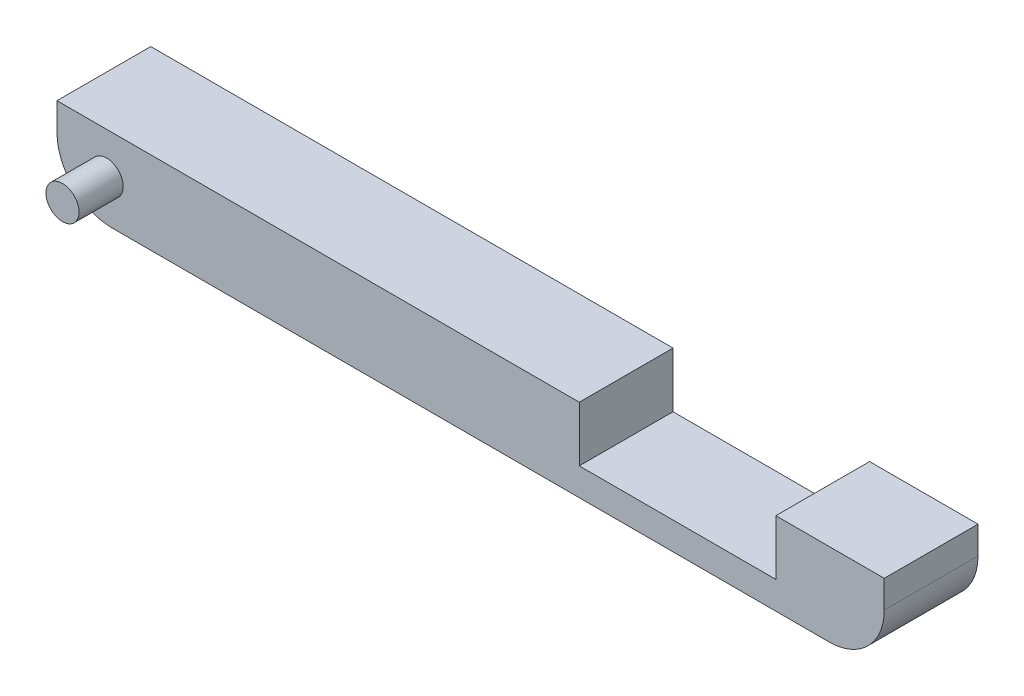
ISO-10303-21;
HEADER;
FILE_DESCRIPTION(('STEP AP214'),'2;1');
FILE_NAME('part.step','',(''),(''),'','','');
FILE_SCHEMA(('AUTOMOTIVE_DESIGN { 1 0 10303 214 1 1 1 1 }'));
ENDSEC;
DATA;
#1=APPLICATION_CONTEXT('core data for automotive mechanical design processes');
#2=APPLICATION_PROTOCOL_DEFINITION('international standard','automotive_design',2000,#1);
#3=PRODUCT_CONTEXT('',#1,'mechanical');
#4=PRODUCT('Part','Part','',(#3));
#5=PRODUCT_RELATED_PRODUCT_CATEGORY('part','',(#4));
#6=PRODUCT_DEFINITION_FORMATION('','',#4);
#7=PRODUCT_DEFINITION_CONTEXT('part definition',#1,'design');
#8=PRODUCT_DEFINITION('design','',#6,#7);
#9=PRODUCT_DEFINITION_SHAPE('','',#8);
#10=(LENGTH_UNIT() NAMED_UNIT(*) SI_UNIT(.MILLI.,.METRE.));
#11=(NAMED_UNIT(*) PLANE_ANGLE_UNIT() SI_UNIT($,.RADIAN.));
#12=(NAMED_UNIT(*) SI_UNIT($,.STERADIAN.) SOLID_ANGLE_UNIT());
#13=UNCERTAINTY_MEASURE_WITH_UNIT(LENGTH_MEASURE(1.E-05),#10,'distance_accuracy_value','');
#14=(GEOMETRIC_REPRESENTATION_CONTEXT(3) GLOBAL_UNCERTAINTY_ASSIGNED_CONTEXT((#13)) GLOBAL_UNIT_ASSIGNED_CONTEXT((#10,
#11,#12)) REPRESENTATION_CONTEXT('',''));
#15=CARTESIAN_POINT('',(0.,0.,0.));
#16=DIRECTION('',(0.,0.,1.));
#17=DIRECTION('',(1.,0.,0.));
#18=AXIS2_PLACEMENT_3D('',#15,#16,#17);
#19=CARTESIAN_POINT('',(34.1093117408907,-5.34817813765183,17.));
#20=DIRECTION('',(-1.,0.,0.));
#21=DIRECTION('',(0.,0.,1.));
#22=AXIS2_PLACEMENT_3D('',#19,#20,#21);
#23=PLANE('',#22);
#24=DIRECTION('',(0.,1.,0.));
#25=VECTOR('',#24,1.);
#26=CARTESIAN_POINT('',(34.1093117408907,-5.34817813765183,0.));
#27=LINE('',#26,#25);
#28=CARTESIAN_POINT('',(34.1093117408907,-15.3481781376518,0.));
#29=VERTEX_POINT('',#28);
#30=CARTESIAN_POINT('',(34.1093117408907,-5.34817813765183,0.));
#31=VERTEX_POINT('',#30);
#32=EDGE_CURVE('E157',#29,#31,#27,.T.);
#33=ORIENTED_EDGE('',*,*,#32,.T.);
#34=DIRECTION('',(0.,0.,-1.));
#35=VECTOR('',#34,1.);
#36=CARTESIAN_POINT('',(34.1093117408907,-5.34817813765183,17.));
#37=LINE('',#36,#35);
#38=CARTESIAN_POINT('',(34.1093117408907,-5.34817813765183,17.));
#39=VERTEX_POINT('',#38);
#40=EDGE_CURVE('E11',#39,#31,#37,.T.);
#41=ORIENTED_EDGE('',*,*,#40,.F.);
#42=DIRECTION('',(0.,1.,0.));
#43=VECTOR('',#42,1.);
#44=CARTESIAN_POINT('',(34.1093117408907,-5.34817813765183,17.));
#45=LINE('',#44,#43);
#46=CARTESIAN_POINT('',(34.1093117408907,-15.3481781376518,17.));
#47=VERTEX_POINT('',#46);
#48=EDGE_CURVE('E187',#47,#39,#45,.T.);
#49=ORIENTED_EDGE('',*,*,#48,.F.);
#50=DIRECTION('',(0.,0.,-1.));
#51=VECTOR('',#50,1.);
#52=CARTESIAN_POINT('',(34.1093117408907,-15.3481781376518,17.));
#53=LINE('',#52,#51);
#54=EDGE_CURVE('E153',#47,#29,#53,.T.);
#55=ORIENTED_EDGE('',*,*,#54,.T.);
#56=EDGE_LOOP('',(#33,#41,#49,#55));
#57=FACE_BOUND('',#56,.T.);
#58=ADVANCED_FACE('F45',(#57),#23,.F.);
#59=CARTESIAN_POINT('',(-60.5906882591093,-5.34817813765183,17.));
#60=DIRECTION('',(0.,-1.,0.));
#61=DIRECTION('',(0.,0.,-1.));
#62=AXIS2_PLACEMENT_3D('',#59,#60,#61);
#63=PLANE('',#62);
#64=DIRECTION('',(-1.,0.,0.));
#65=VECTOR('',#64,1.);
#66=CARTESIAN_POINT('',(-60.5906882591093,-5.34817813765183,0.));
#67=LINE('',#66,#65);
#68=CARTESIAN_POINT('',(-60.5906882591093,-5.34817813765183,0.));
#69=VERTEX_POINT('',#68);
#70=EDGE_CURVE('E161',#31,#69,#67,.T.);
#71=ORIENTED_EDGE('',*,*,#70,.T.);
#72=DIRECTION('',(0.,0.,-1.));
#73=VECTOR('',#72,1.);
#74=CARTESIAN_POINT('',(-60.5906882591093,-5.34817813765183,17.));
#75=LINE('',#74,#73);
#76=CARTESIAN_POINT('',(-60.5906882591093,-5.34817813765183,17.));
#77=VERTEX_POINT('',#76);
#78=EDGE_CURVE('E54',#77,#69,#75,.T.);
#79=ORIENTED_EDGE('',*,*,#78,.F.);
#80=DIRECTION('',(-1.,0.,0.));
#81=VECTOR('',#80,1.);
#82=CARTESIAN_POINT('',(-50.5906882591092,-5.34817813765183,17.));
#83=LINE('',#82,#81);
#84=EDGE_CURVE('E111',#39,#77,#83,.T.);
#85=ORIENTED_EDGE('',*,*,#84,.F.);
#86=ORIENTED_EDGE('',*,*,#40,.T.);
#87=EDGE_LOOP('',(#71,#79,#85,#86));
#88=FACE_BOUND('',#87,.T.);
#89=ADVANCED_FACE('F296',(#88),#63,.F.);
#90=CARTESIAN_POINT('',(-60.5906882591093,-5.34817813765183,17.));
#91=DIRECTION('',(1.,0.,0.));
#92=DIRECTION('',(0.,0.,-1.));
#93=AXIS2_PLACEMENT_3D('',#90,#91,#92);
#94=PLANE('',#93);
#95=DIRECTION('',(0.,-1.,0.));
#96=VECTOR('',#95,1.);
#97=CARTESIAN_POINT('',(-60.5906882591093,-5.34817813765183,0.));
#98=LINE('',#97,#96);
#99=CARTESIAN_POINT('',(-60.5906882591093,-10.3481781376518,0.));
#100=VERTEX_POINT('',#99);
#101=EDGE_CURVE('E165',#69,#100,#98,.T.);
#102=ORIENTED_EDGE('',*,*,#101,.T.);
#103=DIRECTION('',(0.,0.,-1.));
#104=VECTOR('',#103,1.);
#105=CARTESIAN_POINT('',(-60.5906882591093,-10.3481781376518,17.));
#106=LINE('',#105,#104);
#107=CARTESIAN_POINT('',(-60.5906882591093,-10.3481781376518,17.));
#108=VERTEX_POINT('',#107);
#109=EDGE_CURVE('E206',#108,#100,#106,.T.);
#110=ORIENTED_EDGE('',*,*,#109,.F.);
#111=DIRECTION('',(0.,-1.,0.));
#112=VECTOR('',#111,1.);
#113=CARTESIAN_POINT('',(-60.5906882591093,-5.34817813765183,17.));
#114=LINE('',#113,#112);
#115=EDGE_CURVE('E216',#77,#108,#114,.T.);
#116=ORIENTED_EDGE('',*,*,#115,.F.);
#117=ORIENTED_EDGE('',*,*,#78,.T.);
#118=EDGE_LOOP('',(#102,#110,#116,#117));
#119=FACE_BOUND('',#118,.T.);
#120=ADVANCED_FACE('F214',(#119),#94,.F.);
#121=CARTESIAN_POINT('',(-50.5906882591093,-10.3481781376518,17.));
#122=DIRECTION('',(0.,0.,-1.));
#123=DIRECTION('',(-1.,0.,0.));
#124=AXIS2_PLACEMENT_3D('',#121,#122,#123);
#125=CYLINDRICAL_SURFACE('',#124,10.);
#126=CARTESIAN_POINT('',(-50.5906882591093,-10.3481781376518,0.));
#127=DIRECTION('',(0.,0.,1.));
#128=DIRECTION('',(-1.,0.,0.));
#129=AXIS2_PLACEMENT_3D('',#126,#127,#128);
#130=CIRCLE('',#129,10.);
#131=CARTESIAN_POINT('',(-50.5906882591092,-20.3481781376518,0.));
#132=VERTEX_POINT('',#131);
#133=EDGE_CURVE('E168',#100,#132,#130,.T.);
#134=ORIENTED_EDGE('',*,*,#133,.T.);
#135=DIRECTION('',(0.,0.,-1.));
#136=VECTOR('',#135,1.);
#137=CARTESIAN_POINT('',(-50.5906882591092,-20.3481781376518,17.));
#138=LINE('',#137,#136);
#139=CARTESIAN_POINT('',(-50.5906882591092,-20.3481781376518,17.));
#140=VERTEX_POINT('',#139);
#141=EDGE_CURVE('E202',#140,#132,#138,.T.);
#142=ORIENTED_EDGE('',*,*,#141,.F.);
#143=CARTESIAN_POINT('',(-50.5906882591093,-10.3481781376518,17.));
#144=DIRECTION('',(0.,0.,1.));
#145=DIRECTION('',(-1.,0.,0.));
#146=AXIS2_PLACEMENT_3D('',#143,#144,#145);
#147=CIRCLE('',#146,10.);
#148=EDGE_CURVE('E235',#108,#140,#147,.T.);
#149=ORIENTED_EDGE('',*,*,#148,.F.);
#150=ORIENTED_EDGE('',*,*,#109,.T.);
#151=EDGE_LOOP('',(#134,#142,#149,#150));
#152=FACE_BOUND('',#151,.T.);
#153=ADVANCED_FACE('F225',(#152),#125,.T.);
#154=CARTESIAN_POINT('',(-50.5906882591092,-20.3481781376518,17.));
#155=DIRECTION('',(0.,1.,0.));
#156=DIRECTION('',(0.,0.,1.));
#157=AXIS2_PLACEMENT_3D('',#154,#155,#156);
#158=PLANE('',#157);
#159=DIRECTION('',(1.,0.,0.));
#160=VECTOR('',#159,1.);
#161=CARTESIAN_POINT('',(-50.5906882591092,-20.3481781376518,0.));
#162=LINE('',#161,#160);
#163=CARTESIAN_POINT('',(79.4093117408906,-20.3481781376518,0.));
#164=VERTEX_POINT('',#163);
#165=EDGE_CURVE('E171',#132,#164,#162,.T.);
#166=ORIENTED_EDGE('',*,*,#165,.T.);
#167=DIRECTION('',(0.,0.,-1.));
#168=VECTOR('',#167,1.);
#169=CARTESIAN_POINT('',(79.4093117408906,-20.3481781376518,17.));
#170=LINE('',#169,#168);
#171=CARTESIAN_POINT('',(79.4093117408906,-20.3481781376518,17.));
#172=VERTEX_POINT('',#171);
#173=EDGE_CURVE('E198',#172,#164,#170,.T.);
#174=ORIENTED_EDGE('',*,*,#173,.F.);
#175=DIRECTION('',(1.,0.,0.));
#176=VECTOR('',#175,1.);
#177=CARTESIAN_POINT('',(-50.5906882591092,-20.3481781376518,17.));
#178=LINE('',#177,#176);
#179=EDGE_CURVE('E231',#140,#172,#178,.T.);
#180=ORIENTED_EDGE('',*,*,#179,.F.);
#181=ORIENTED_EDGE('',*,*,#141,.T.);
#182=EDGE_LOOP('',(#166,#174,#180,#181));
#183=FACE_BOUND('',#182,.T.);
#184=ADVANCED_FACE('F229',(#183),#158,.F.);
#185=CARTESIAN_POINT('',(79.4093117408907,-10.3481781376518,17.));
#186=DIRECTION('',(0.,0.,-1.));
#187=DIRECTION('',(-1.,0.,0.));
#188=AXIS2_PLACEMENT_3D('',#185,#186,#187);
#189=CYLINDRICAL_SURFACE('',#188,10.);
#190=CARTESIAN_POINT('',(79.4093117408907,-10.3481781376518,0.));
#191=DIRECTION('',(0.,0.,1.));
#192=DIRECTION('',(1.,0.,0.));
#193=AXIS2_PLACEMENT_3D('',#190,#191,#192);
#194=CIRCLE('',#193,10.);
#195=CARTESIAN_POINT('',(89.4093117408907,-10.3481781376518,0.));
#196=VERTEX_POINT('',#195);
#197=EDGE_CURVE('E174',#164,#196,#194,.T.);
#198=ORIENTED_EDGE('',*,*,#197,.T.);
#199=DIRECTION('',(0.,0.,-1.));
#200=VECTOR('',#199,1.);
#201=CARTESIAN_POINT('',(89.4093117408907,-10.3481781376518,17.));
#202=LINE('',#201,#200);
#203=CARTESIAN_POINT('',(89.4093117408907,-10.3481781376518,17.));
#204=VERTEX_POINT('',#203);
#205=EDGE_CURVE('E194',#204,#196,#202,.T.);
#206=ORIENTED_EDGE('',*,*,#205,.F.);
#207=CARTESIAN_POINT('',(79.4093117408907,-10.3481781376518,17.));
#208=DIRECTION('',(0.,0.,1.));
#209=DIRECTION('',(1.,0.,0.));
#210=AXIS2_PLACEMENT_3D('',#207,#208,#209);
#211=CIRCLE('',#210,10.);
#212=EDGE_CURVE('E234',#172,#204,#211,.T.);
#213=ORIENTED_EDGE('',*,*,#212,.F.);
#214=ORIENTED_EDGE('',*,*,#173,.T.);
#215=EDGE_LOOP('',(#198,#206,#213,#214));
#216=FACE_BOUND('',#215,.T.);
#217=ADVANCED_FACE('F308',(#216),#189,.T.);
#218=CARTESIAN_POINT('',(89.4093117408907,-5.34817813765182,17.));
#219=DIRECTION('',(-1.,0.,0.));
#220=DIRECTION('',(0.,0.,1.));
#221=AXIS2_PLACEMENT_3D('',#218,#219,#220);
#222=PLANE('',#221);
#223=DIRECTION('',(0.,1.,0.));
#224=VECTOR('',#223,1.);
#225=CARTESIAN_POINT('',(89.4093117408907,-5.34817813765182,0.));
#226=LINE('',#225,#224);
#227=CARTESIAN_POINT('',(89.4093117408907,-5.34817813765182,0.));
#228=VERTEX_POINT('',#227);
#229=EDGE_CURVE('E177',#196,#228,#226,.T.);
#230=ORIENTED_EDGE('',*,*,#229,.T.);
#231=DIRECTION('',(0.,0.,-1.));
#232=VECTOR('',#231,1.);
#233=CARTESIAN_POINT('',(89.4093117408907,-5.34817813765182,17.));
#234=LINE('',#233,#232);
#235=CARTESIAN_POINT('',(89.4093117408907,-5.34817813765182,17.));
#236=VERTEX_POINT('',#235);
#237=EDGE_CURVE('E146',#236,#228,#234,.T.);
#238=ORIENTED_EDGE('',*,*,#237,.F.);
#239=DIRECTION('',(0.,1.,0.));
#240=VECTOR('',#239,1.);
#241=CARTESIAN_POINT('',(89.4093117408907,-5.34817813765182,17.));
#242=LINE('',#241,#240);
#243=EDGE_CURVE('E136',#204,#236,#242,.T.);
#244=ORIENTED_EDGE('',*,*,#243,.F.);
#245=ORIENTED_EDGE('',*,*,#205,.T.);
#246=EDGE_LOOP('',(#230,#238,#244,#245));
#247=FACE_BOUND('',#246,.T.);
#248=ADVANCED_FACE('F305',(#247),#222,.F.);
#249=CARTESIAN_POINT('',(69.7493117408907,-5.34817813765182,17.));
#250=DIRECTION('',(0.,-1.,0.));
#251=DIRECTION('',(1.,0.,0.));
#252=AXIS2_PLACEMENT_3D('',#249,#250,#251);
#253=PLANE('',#252);
#254=DIRECTION('',(-1.,0.,0.));
#255=VECTOR('',#254,1.);
#256=CARTESIAN_POINT('',(69.7493117408907,-5.34817813765182,0.));
#257=LINE('',#256,#255);
#258=CARTESIAN_POINT('',(69.7493117408907,-5.34817813765182,0.));
#259=VERTEX_POINT('',#258);
#260=EDGE_CURVE('E144',#228,#259,#257,.T.);
#261=ORIENTED_EDGE('',*,*,#260,.T.);
#262=DIRECTION('',(0.,0.,-1.));
#263=VECTOR('',#262,1.);
#264=CARTESIAN_POINT('',(69.7493117408907,-5.34817813765182,17.));
#265=LINE('',#264,#263);
#266=CARTESIAN_POINT('',(69.7493117408907,-5.34817813765182,17.));
#267=VERTEX_POINT('',#266);
#268=EDGE_CURVE('E142',#267,#259,#265,.T.);
#269=ORIENTED_EDGE('',*,*,#268,.F.);
#270=DIRECTION('',(-1.,0.,0.));
#271=VECTOR('',#270,1.);
#272=CARTESIAN_POINT('',(79.4093117408906,-5.34817813765182,17.));
#273=LINE('',#272,#271);
#274=EDGE_CURVE('E130',#236,#267,#273,.T.);
#275=ORIENTED_EDGE('',*,*,#274,.F.);
#276=ORIENTED_EDGE('',*,*,#237,.T.);
#277=EDGE_LOOP('',(#261,#269,#275,#276));
#278=FACE_BOUND('',#277,.T.);
#279=ADVANCED_FACE('F143',(#278),#253,.F.);
#280=CARTESIAN_POINT('',(69.7493117408907,-15.3481781376518,17.));
#281=DIRECTION('',(1.,0.,0.));
#282=DIRECTION('',(0.,0.,-1.));
#283=AXIS2_PLACEMENT_3D('',#280,#281,#282);
#284=PLANE('',#283);
#285=DIRECTION('',(0.,-1.,0.));
#286=VECTOR('',#285,1.);
#287=CARTESIAN_POINT('',(69.7493117408907,-15.3481781376518,0.));
#288=LINE('',#287,#286);
#289=CARTESIAN_POINT('',(69.7493117408907,-15.3481781376518,0.));
#290=VERTEX_POINT('',#289);
#291=EDGE_CURVE('E97',#259,#290,#288,.T.);
#292=ORIENTED_EDGE('',*,*,#291,.T.);
#293=DIRECTION('',(0.,0.,-1.));
#294=VECTOR('',#293,1.);
#295=CARTESIAN_POINT('',(69.7493117408907,-15.3481781376518,17.));
#296=LINE('',#295,#294);
#297=CARTESIAN_POINT('',(69.7493117408907,-15.3481781376518,17.));
#298=VERTEX_POINT('',#297);
#299=EDGE_CURVE('E147',#298,#290,#296,.T.);
#300=ORIENTED_EDGE('',*,*,#299,.F.);
#301=DIRECTION('',(0.,-1.,0.));
#302=VECTOR('',#301,1.);
#303=CARTESIAN_POINT('',(69.7493117408907,-15.3481781376518,17.));
#304=LINE('',#303,#302);
#305=EDGE_CURVE('E134',#267,#298,#304,.T.);
#306=ORIENTED_EDGE('',*,*,#305,.F.);
#307=ORIENTED_EDGE('',*,*,#268,.T.);
#308=EDGE_LOOP('',(#292,#300,#306,#307));
#309=FACE_BOUND('',#308,.T.);
#310=ADVANCED_FACE('F149',(#309),#284,.F.);
#311=CARTESIAN_POINT('',(34.1093117408907,-15.3481781376518,17.));
#312=DIRECTION('',(0.,-1.,0.));
#313=DIRECTION('',(1.,0.,0.));
#314=AXIS2_PLACEMENT_3D('',#311,#312,#313);
#315=PLANE('',#314);
#316=DIRECTION('',(-1.,0.,0.));
#317=VECTOR('',#316,1.);
#318=CARTESIAN_POINT('',(34.1093117408907,-15.3481781376518,0.));
#319=LINE('',#318,#317);
#320=EDGE_CURVE('E103',#290,#29,#319,.T.);
#321=ORIENTED_EDGE('',*,*,#320,.T.);
#322=ORIENTED_EDGE('',*,*,#54,.F.);
#323=DIRECTION('',(-1.,0.,0.));
#324=VECTOR('',#323,1.);
#325=CARTESIAN_POINT('',(34.1093117408907,-15.3481781376518,17.));
#326=LINE('',#325,#324);
#327=EDGE_CURVE('E62',#298,#47,#326,.T.);
#328=ORIENTED_EDGE('',*,*,#327,.F.);
#329=ORIENTED_EDGE('',*,*,#299,.T.);
#330=EDGE_LOOP('',(#321,#322,#328,#329));
#331=FACE_BOUND('',#330,.T.);
#332=ADVANCED_FACE('F283',(#331),#315,.F.);
#333=CARTESIAN_POINT('',(79.4093117408907,-10.3481781376518,17.));
#334=DIRECTION('',(0.,0.,1.));
#335=DIRECTION('',(1.,0.,0.));
#336=AXIS2_PLACEMENT_3D('',#333,#334,#335);
#337=PLANE('',#336);
#338=CARTESIAN_POINT('',(-51.5906882591093,-12.8481781376518,17.));
#339=DIRECTION('',(0.,0.,1.));
#340=DIRECTION('',(1.,0.,0.));
#341=AXIS2_PLACEMENT_3D('',#338,#339,#340);
#342=CIRCLE('',#341,3.);
#343=CARTESIAN_POINT('',(-48.5906882591093,-12.8481781376518,17.));
#344=VERTEX_POINT('',#343);
#345=EDGE_CURVE('E265',#344,#344,#342,.T.);
#346=ORIENTED_EDGE('',*,*,#345,.F.);
#347=EDGE_LOOP('',(#346));
#348=FACE_BOUND('',#347,.T.);
#349=ORIENTED_EDGE('',*,*,#48,.T.);
#350=ORIENTED_EDGE('',*,*,#84,.T.);
#351=ORIENTED_EDGE('',*,*,#115,.T.);
#352=ORIENTED_EDGE('',*,*,#148,.T.);
#353=ORIENTED_EDGE('',*,*,#179,.T.);
#354=ORIENTED_EDGE('',*,*,#212,.T.);
#355=ORIENTED_EDGE('',*,*,#243,.T.);
#356=ORIENTED_EDGE('',*,*,#274,.T.);
#357=ORIENTED_EDGE('',*,*,#305,.T.);
#358=ORIENTED_EDGE('',*,*,#327,.T.);
#359=EDGE_LOOP('',(#349,#350,#351,#352,#353,#354,#355,#356,#357,#358));
#360=FACE_BOUND('',#359,.T.);
#361=ADVANCED_FACE('F132',(#348,#360),#337,.T.);
#362=CARTESIAN_POINT('',(79.4093117408907,-10.3481781376518,0.));
#363=DIRECTION('',(0.,0.,1.));
#364=DIRECTION('',(1.,0.,0.));
#365=AXIS2_PLACEMENT_3D('',#362,#363,#364);
#366=PLANE('',#365);
#367=CARTESIAN_POINT('',(-51.5906882591093,-12.8481781376518,0.));
#368=DIRECTION('',(0.,0.,-1.));
#369=DIRECTION('',(-1.,0.,0.));
#370=AXIS2_PLACEMENT_3D('',#367,#368,#369);
#371=CIRCLE('',#370,3.25);
#372=CARTESIAN_POINT('',(-54.8406882591093,-12.8481781376518,0.));
#373=VERTEX_POINT('',#372);
#374=EDGE_CURVE('E258',#373,#373,#371,.T.);
#375=ORIENTED_EDGE('',*,*,#374,.F.);
#376=EDGE_LOOP('',(#375));
#377=FACE_BOUND('',#376,.T.);
#378=CARTESIAN_POINT('',(14.4093117408907,-12.8481781376518,0.));
#379=DIRECTION('',(0.,0.,-1.));
#380=DIRECTION('',(-1.,0.,0.));
#381=AXIS2_PLACEMENT_3D('',#378,#379,#380);
#382=CIRCLE('',#381,3.25);
#383=CARTESIAN_POINT('',(11.1593117408907,-12.8481781376518,0.));
#384=VERTEX_POINT('',#383);
#385=EDGE_CURVE('E253',#384,#384,#382,.T.);
#386=ORIENTED_EDGE('',*,*,#385,.F.);
#387=EDGE_LOOP('',(#386));
#388=FACE_BOUND('',#387,.T.);
#389=ORIENTED_EDGE('',*,*,#32,.F.);
#390=ORIENTED_EDGE('',*,*,#320,.F.);
#391=ORIENTED_EDGE('',*,*,#291,.F.);
#392=ORIENTED_EDGE('',*,*,#260,.F.);
#393=ORIENTED_EDGE('',*,*,#229,.F.);
#394=ORIENTED_EDGE('',*,*,#197,.F.);
#395=ORIENTED_EDGE('',*,*,#165,.F.);
#396=ORIENTED_EDGE('',*,*,#133,.F.);
#397=ORIENTED_EDGE('',*,*,#101,.F.);
#398=ORIENTED_EDGE('',*,*,#70,.F.);
#399=EDGE_LOOP('',(#389,#390,#391,#392,#393,#394,#395,#396,#397,#398));
#400=FACE_BOUND('',#399,.T.);
#401=ADVANCED_FACE('F220',(#377,#388,#400),#366,.F.);
#402=CARTESIAN_POINT('',(14.4093117408907,-12.8481781376518,6.));
#403=DIRECTION('',(0.,0.,-1.));
#404=DIRECTION('',(-1.,0.,0.));
#405=AXIS2_PLACEMENT_3D('',#402,#403,#404);
#406=CYLINDRICAL_SURFACE('',#405,3.25);
#407=CARTESIAN_POINT('',(14.4093117408907,-12.8481781376518,6.));
#408=DIRECTION('',(0.,0.,-1.));
#409=DIRECTION('',(-1.,0.,0.));
#410=AXIS2_PLACEMENT_3D('',#407,#408,#409);
#411=CIRCLE('',#410,3.25);
#412=CARTESIAN_POINT('',(11.1593117408907,-12.8481781376518,6.));
#413=VERTEX_POINT('',#412);
#414=EDGE_CURVE('E249',#413,#413,#411,.T.);
#415=ORIENTED_EDGE('',*,*,#414,.F.);
#416=EDGE_LOOP('',(#415));
#417=FACE_BOUND('',#416,.T.);
#418=ORIENTED_EDGE('',*,*,#385,.T.);
#419=EDGE_LOOP('',(#418));
#420=FACE_BOUND('',#419,.T.);
#421=ADVANCED_FACE('F289',(#417,#420),#406,.F.);
#422=CARTESIAN_POINT('',(14.4093117408907,-12.8481781376518,6.));
#423=DIRECTION('',(0.,0.,-1.));
#424=DIRECTION('',(-1.,0.,0.));
#425=AXIS2_PLACEMENT_3D('',#422,#423,#424);
#426=PLANE('',#425);
#427=ORIENTED_EDGE('',*,*,#414,.T.);
#428=EDGE_LOOP('',(#427));
#429=FACE_BOUND('',#428,.T.);
#430=ADVANCED_FACE('F390',(#429),#426,.T.);
#431=CARTESIAN_POINT('',(-51.5906882591093,-12.8481781376518,6.));
#432=DIRECTION('',(0.,0.,-1.));
#433=DIRECTION('',(-1.,0.,0.));
#434=AXIS2_PLACEMENT_3D('',#431,#432,#433);
#435=CYLINDRICAL_SURFACE('',#434,3.25);
#436=CARTESIAN_POINT('',(-51.5906882591093,-12.8481781376518,6.));
#437=DIRECTION('',(0.,0.,-1.));
#438=DIRECTION('',(-1.,0.,0.));
#439=AXIS2_PLACEMENT_3D('',#436,#437,#438);
#440=CIRCLE('',#439,3.25);
#441=CARTESIAN_POINT('',(-54.8406882591093,-12.8481781376518,6.));
#442=VERTEX_POINT('',#441);
#443=EDGE_CURVE('E162',#442,#442,#440,.T.);
#444=ORIENTED_EDGE('',*,*,#443,.F.);
#445=EDGE_LOOP('',(#444));
#446=FACE_BOUND('',#445,.T.);
#447=ORIENTED_EDGE('',*,*,#374,.T.);
#448=EDGE_LOOP('',(#447));
#449=FACE_BOUND('',#448,.T.);
#450=ADVANCED_FACE('F400',(#446,#449),#435,.F.);
#451=CARTESIAN_POINT('',(-51.5906882591093,-12.8481781376518,6.));
#452=DIRECTION('',(0.,0.,-1.));
#453=DIRECTION('',(-1.,0.,0.));
#454=AXIS2_PLACEMENT_3D('',#451,#452,#453);
#455=PLANE('',#454);
#456=ORIENTED_EDGE('',*,*,#443,.T.);
#457=EDGE_LOOP('',(#456));
#458=FACE_BOUND('',#457,.T.);
#459=ADVANCED_FACE('F278',(#458),#455,.T.);
#460=CARTESIAN_POINT('',(-51.5906882591093,-12.8481781376518,25.));
#461=DIRECTION('',(0.,0.,-1.));
#462=DIRECTION('',(-1.,0.,0.));
#463=AXIS2_PLACEMENT_3D('',#460,#461,#462);
#464=CYLINDRICAL_SURFACE('',#463,3.);
#465=CARTESIAN_POINT('',(-51.5906882591093,-12.8481781376518,25.));
#466=DIRECTION('',(0.,0.,1.));
#467=DIRECTION('',(1.,0.,0.));
#468=AXIS2_PLACEMENT_3D('',#465,#466,#467);
#469=CIRCLE('',#468,3.);
#470=CARTESIAN_POINT('',(-48.5906882591093,-12.8481781376518,25.));
#471=VERTEX_POINT('',#470);
#472=EDGE_CURVE('E254',#471,#471,#469,.T.);
#473=ORIENTED_EDGE('',*,*,#472,.F.);
#474=EDGE_LOOP('',(#473));
#475=FACE_BOUND('',#474,.T.);
#476=ORIENTED_EDGE('',*,*,#345,.T.);
#477=EDGE_LOOP('',(#476));
#478=FACE_BOUND('',#477,.T.);
#479=ADVANCED_FACE('F275',(#475,#478),#464,.T.);
#480=CARTESIAN_POINT('',(-51.5906882591093,-12.8481781376518,25.));
#481=DIRECTION('',(0.,0.,1.));
#482=DIRECTION('',(1.,0.,0.));
#483=AXIS2_PLACEMENT_3D('',#480,#481,#482);
#484=PLANE('',#483);
#485=ORIENTED_EDGE('',*,*,#472,.T.);
#486=EDGE_LOOP('',(#485));
#487=FACE_BOUND('',#486,.T.);
#488=ADVANCED_FACE('F273',(#487),#484,.T.);
#489=CLOSED_SHELL('',(#58,#89,#120,#153,#184,#217,#248,#279,#310,#332,#361,#401,#421,#430,#450,
#459,#479,#488));
#490=MANIFOLD_SOLID_BREP('B2',#489);
#491=ADVANCED_BREP_SHAPE_REPRESENTATION('',(#18,#490),#14);
#492=SHAPE_DEFINITION_REPRESENTATION(#9,#491);
ENDSEC;
END-ISO-10303-21;
